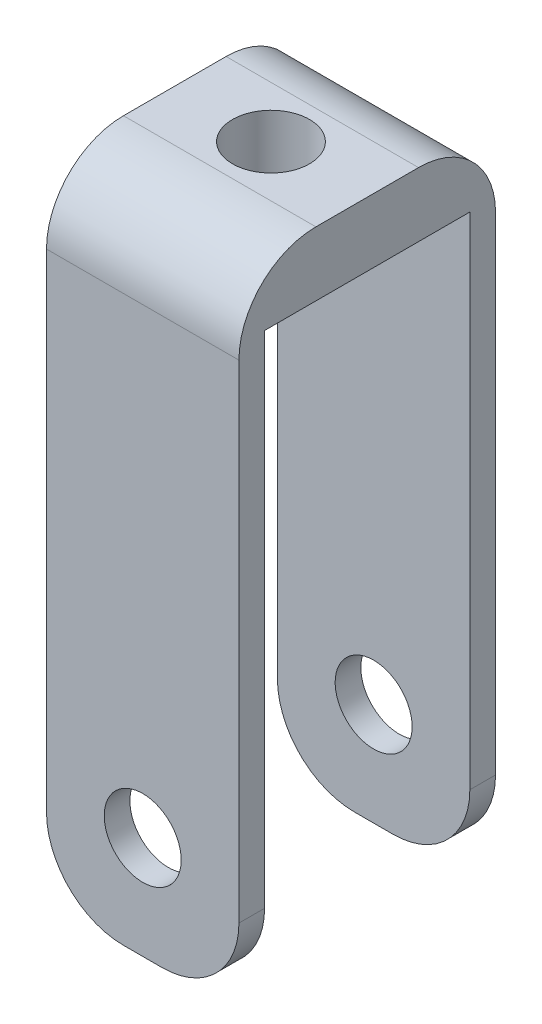
ISO-10303-21;
HEADER;
FILE_DESCRIPTION(('STEP AP214'),'2;1');
FILE_NAME('part.step','',(''),(''),'','','');
FILE_SCHEMA(('AUTOMOTIVE_DESIGN { 1 0 10303 214 1 1 1 1 }'));
ENDSEC;
DATA;
#1=APPLICATION_CONTEXT('core data for automotive mechanical design processes');
#2=APPLICATION_PROTOCOL_DEFINITION('international standard','automotive_design',2000,#1);
#3=PRODUCT_CONTEXT('',#1,'mechanical');
#4=PRODUCT('Part','Part','',(#3));
#5=PRODUCT_RELATED_PRODUCT_CATEGORY('part','',(#4));
#6=PRODUCT_DEFINITION_FORMATION('','',#4);
#7=PRODUCT_DEFINITION_CONTEXT('part definition',#1,'design');
#8=PRODUCT_DEFINITION('design','',#6,#7);
#9=PRODUCT_DEFINITION_SHAPE('','',#8);
#10=(LENGTH_UNIT() NAMED_UNIT(*) SI_UNIT(.MILLI.,.METRE.));
#11=(NAMED_UNIT(*) PLANE_ANGLE_UNIT() SI_UNIT($,.RADIAN.));
#12=(NAMED_UNIT(*) SI_UNIT($,.STERADIAN.) SOLID_ANGLE_UNIT());
#13=UNCERTAINTY_MEASURE_WITH_UNIT(LENGTH_MEASURE(1.E-05),#10,'distance_accuracy_value','');
#14=(GEOMETRIC_REPRESENTATION_CONTEXT(3) GLOBAL_UNCERTAINTY_ASSIGNED_CONTEXT((#13)) GLOBAL_UNIT_ASSIGNED_CONTEXT((#10,
#11,#12)) REPRESENTATION_CONTEXT('',''));
#15=CARTESIAN_POINT('',(0.,0.,0.));
#16=DIRECTION('',(0.,0.,1.));
#17=DIRECTION('',(1.,0.,0.));
#18=AXIS2_PLACEMENT_3D('',#15,#16,#17);
#19=CARTESIAN_POINT('',(7.5,0.,0.));
#20=DIRECTION('',(0.,-1.,0.));
#21=DIRECTION('',(0.,0.,-1.));
#22=AXIS2_PLACEMENT_3D('',#19,#20,#21);
#23=PLANE('',#22);
#24=CARTESIAN_POINT('',(0.,0.,0.));
#25=DIRECTION('',(0.,1.,0.));
#26=DIRECTION('',(0.,0.,1.));
#27=AXIS2_PLACEMENT_3D('',#24,#25,#26);
#28=CIRCLE('',#27,3.);
#29=CARTESIAN_POINT('',(0.,0.,3.));
#30=VERTEX_POINT('',#29);
#31=EDGE_CURVE('E200',#30,#30,#28,.T.);
#32=ORIENTED_EDGE('',*,*,#31,.F.);
#33=EDGE_LOOP('',(#32));
#34=FACE_BOUND('',#33,.T.);
#35=DIRECTION('',(0.,0.,1.));
#36=VECTOR('',#35,1.);
#37=CARTESIAN_POINT('',(7.5,0.,0.));
#38=LINE('',#37,#36);
#39=CARTESIAN_POINT('',(7.5,0.,-4.));
#40=VERTEX_POINT('',#39);
#41=CARTESIAN_POINT('',(7.5,0.,4.));
#42=VERTEX_POINT('',#41);
#43=EDGE_CURVE('E187',#40,#42,#38,.T.);
#44=ORIENTED_EDGE('',*,*,#43,.F.);
#45=DIRECTION('',(-1.,0.,0.));
#46=VECTOR('',#45,1.);
#47=CARTESIAN_POINT('',(7.5,0.,-4.));
#48=LINE('',#47,#46);
#49=CARTESIAN_POINT('',(-7.5,0.,-4.));
#50=VERTEX_POINT('',#49);
#51=EDGE_CURVE('E202',#40,#50,#48,.T.);
#52=ORIENTED_EDGE('',*,*,#51,.T.);
#53=DIRECTION('',(0.,0.,1.));
#54=VECTOR('',#53,1.);
#55=CARTESIAN_POINT('',(-7.5,0.,0.));
#56=LINE('',#55,#54);
#57=CARTESIAN_POINT('',(-7.5,0.,4.));
#58=VERTEX_POINT('',#57);
#59=EDGE_CURVE('E172',#50,#58,#56,.T.);
#60=ORIENTED_EDGE('',*,*,#59,.T.);
#61=DIRECTION('',(-1.,0.,0.));
#62=VECTOR('',#61,1.);
#63=CARTESIAN_POINT('',(7.5,0.,4.));
#64=LINE('',#63,#62);
#65=EDGE_CURVE('E197',#58,#42,#64,.F.);
#66=ORIENTED_EDGE('',*,*,#65,.T.);
#67=EDGE_LOOP('',(#44,#52,#60,#66));
#68=FACE_BOUND('',#67,.T.);
#69=ADVANCED_FACE('F35',(#34,#68),#23,.F.);
#70=CARTESIAN_POINT('',(7.5,0.,10.));
#71=DIRECTION('',(0.,0.,-1.));
#72=DIRECTION('',(0.,1.,0.));
#73=AXIS2_PLACEMENT_3D('',#70,#71,#72);
#74=PLANE('',#73);
#75=CARTESIAN_POINT('',(0.,-42.,10.));
#76=DIRECTION('',(0.,0.,1.));
#77=DIRECTION('',(1.,0.,0.));
#78=AXIS2_PLACEMENT_3D('',#75,#76,#77);
#79=CIRCLE('',#78,3.);
#80=CARTESIAN_POINT('',(3.,-42.,10.));
#81=VERTEX_POINT('',#80);
#82=EDGE_CURVE('E285',#81,#81,#79,.T.);
#83=ORIENTED_EDGE('',*,*,#82,.F.);
#84=EDGE_LOOP('',(#83));
#85=FACE_BOUND('',#84,.T.);
#86=DIRECTION('',(0.,-1.,0.));
#87=VECTOR('',#86,1.);
#88=CARTESIAN_POINT('',(7.5,0.,10.));
#89=LINE('',#88,#87);
#90=CARTESIAN_POINT('',(7.5,-6.,10.));
#91=VERTEX_POINT('',#90);
#92=CARTESIAN_POINT('',(7.5,-44.,9.99999999999999));
#93=VERTEX_POINT('',#92);
#94=EDGE_CURVE('E148',#91,#93,#89,.T.);
#95=ORIENTED_EDGE('',*,*,#94,.F.);
#96=DIRECTION('',(-1.,0.,0.));
#97=VECTOR('',#96,1.);
#98=CARTESIAN_POINT('',(7.5,-6.,10.));
#99=LINE('',#98,#97);
#100=CARTESIAN_POINT('',(-7.5,-6.,10.));
#101=VERTEX_POINT('',#100);
#102=EDGE_CURVE('E231',#91,#101,#99,.T.);
#103=ORIENTED_EDGE('',*,*,#102,.T.);
#104=DIRECTION('',(0.,-1.,0.));
#105=VECTOR('',#104,1.);
#106=CARTESIAN_POINT('',(-7.5,0.,10.));
#107=LINE('',#106,#105);
#108=CARTESIAN_POINT('',(-7.5,-44.,9.99999999999999));
#109=VERTEX_POINT('',#108);
#110=EDGE_CURVE('E175',#101,#109,#107,.T.);
#111=ORIENTED_EDGE('',*,*,#110,.T.);
#112=CARTESIAN_POINT('',(-1.5,-44.,9.99999999999999));
#113=DIRECTION('',(0.,0.,-1.));
#114=DIRECTION('',(0.,1.,0.));
#115=AXIS2_PLACEMENT_3D('',#112,#113,#114);
#116=CIRCLE('',#115,6.);
#117=CARTESIAN_POINT('',(-1.5,-50.,9.99999999999999));
#118=VERTEX_POINT('',#117);
#119=EDGE_CURVE('E229',#109,#118,#116,.F.);
#120=ORIENTED_EDGE('',*,*,#119,.T.);
#121=DIRECTION('',(-1.,0.,0.));
#122=VECTOR('',#121,1.);
#123=CARTESIAN_POINT('',(7.5,-50.,9.99999999999999));
#124=LINE('',#123,#122);
#125=CARTESIAN_POINT('',(1.5,-50.,9.99999999999999));
#126=VERTEX_POINT('',#125);
#127=EDGE_CURVE('E194',#126,#118,#124,.T.);
#128=ORIENTED_EDGE('',*,*,#127,.F.);
#129=CARTESIAN_POINT('',(1.5,-44.,9.99999999999999));
#130=DIRECTION('',(0.,0.,-1.));
#131=DIRECTION('',(0.,1.,0.));
#132=AXIS2_PLACEMENT_3D('',#129,#130,#131);
#133=CIRCLE('',#132,6.);
#134=EDGE_CURVE('E227',#126,#93,#133,.F.);
#135=ORIENTED_EDGE('',*,*,#134,.T.);
#136=EDGE_LOOP('',(#95,#103,#111,#120,#128,#135));
#137=FACE_BOUND('',#136,.T.);
#138=ADVANCED_FACE('F310',(#85,#137),#74,.F.);
#139=CARTESIAN_POINT('',(7.5,-50.,9.99999999999999));
#140=DIRECTION('',(0.,1.,0.));
#141=DIRECTION('',(0.,0.,1.));
#142=AXIS2_PLACEMENT_3D('',#139,#140,#141);
#143=PLANE('',#142);
#144=ORIENTED_EDGE('',*,*,#127,.T.);
#145=DIRECTION('',(0.,0.,-1.));
#146=VECTOR('',#145,1.);
#147=CARTESIAN_POINT('',(-1.5,-50.,9.99999999999999));
#148=LINE('',#147,#146);
#149=CARTESIAN_POINT('',(-1.5,-50.,7.99999999999999));
#150=VERTEX_POINT('',#149);
#151=EDGE_CURVE('E236',#118,#150,#148,.T.);
#152=ORIENTED_EDGE('',*,*,#151,.T.);
#153=DIRECTION('',(-1.,0.,0.));
#154=VECTOR('',#153,1.);
#155=CARTESIAN_POINT('',(7.5,-50.,7.99999999999999));
#156=LINE('',#155,#154);
#157=CARTESIAN_POINT('',(1.5,-50.,7.99999999999999));
#158=VERTEX_POINT('',#157);
#159=EDGE_CURVE('E158',#158,#150,#156,.T.);
#160=ORIENTED_EDGE('',*,*,#159,.F.);
#161=DIRECTION('',(0.,0.,-1.));
#162=VECTOR('',#161,1.);
#163=CARTESIAN_POINT('',(1.5,-50.,9.99999999999999));
#164=LINE('',#163,#162);
#165=EDGE_CURVE('E234',#158,#126,#164,.F.);
#166=ORIENTED_EDGE('',*,*,#165,.T.);
#167=EDGE_LOOP('',(#144,#152,#160,#166));
#168=FACE_BOUND('',#167,.T.);
#169=ADVANCED_FACE('F316',(#168),#143,.F.);
#170=CARTESIAN_POINT('',(7.5,-50.,7.99999999999999));
#171=DIRECTION('',(0.,0.,1.));
#172=DIRECTION('',(1.,0.,0.));
#173=AXIS2_PLACEMENT_3D('',#170,#171,#172);
#174=PLANE('',#173);
#175=CARTESIAN_POINT('',(0.,-42.,7.99999999999999));
#176=DIRECTION('',(0.,0.,1.));
#177=DIRECTION('',(1.,0.,0.));
#178=AXIS2_PLACEMENT_3D('',#175,#176,#177);
#179=CIRCLE('',#178,3.);
#180=CARTESIAN_POINT('',(3.,-42.,7.99999999999999));
#181=VERTEX_POINT('',#180);
#182=EDGE_CURVE('E278',#181,#181,#179,.T.);
#183=ORIENTED_EDGE('',*,*,#182,.T.);
#184=EDGE_LOOP('',(#183));
#185=FACE_BOUND('',#184,.T.);
#186=ORIENTED_EDGE('',*,*,#159,.T.);
#187=CARTESIAN_POINT('',(-1.5,-44.,7.99999999999999));
#188=DIRECTION('',(0.,0.,1.));
#189=DIRECTION('',(1.,0.,0.));
#190=AXIS2_PLACEMENT_3D('',#187,#188,#189);
#191=CIRCLE('',#190,6.);
#192=CARTESIAN_POINT('',(-7.5,-44.,7.99999999999999));
#193=VERTEX_POINT('',#192);
#194=EDGE_CURVE('E241',#150,#193,#191,.F.);
#195=ORIENTED_EDGE('',*,*,#194,.T.);
#196=DIRECTION('',(0.,1.,0.));
#197=VECTOR('',#196,1.);
#198=CARTESIAN_POINT('',(-7.5,-50.,7.99999999999999));
#199=LINE('',#198,#197);
#200=CARTESIAN_POINT('',(-7.5,-5.,7.99999999999999));
#201=VERTEX_POINT('',#200);
#202=EDGE_CURVE('E155',#193,#201,#199,.T.);
#203=ORIENTED_EDGE('',*,*,#202,.T.);
#204=DIRECTION('',(-1.,0.,0.));
#205=VECTOR('',#204,1.);
#206=CARTESIAN_POINT('',(7.5,-5.,7.99999999999999));
#207=LINE('',#206,#205);
#208=CARTESIAN_POINT('',(7.5,-5.,7.99999999999999));
#209=VERTEX_POINT('',#208);
#210=EDGE_CURVE('E151',#209,#201,#207,.T.);
#211=ORIENTED_EDGE('',*,*,#210,.F.);
#212=DIRECTION('',(0.,1.,0.));
#213=VECTOR('',#212,1.);
#214=CARTESIAN_POINT('',(7.5,-50.,7.99999999999999));
#215=LINE('',#214,#213);
#216=CARTESIAN_POINT('',(7.5,-44.,7.99999999999999));
#217=VERTEX_POINT('',#216);
#218=EDGE_CURVE('E136',#217,#209,#215,.T.);
#219=ORIENTED_EDGE('',*,*,#218,.F.);
#220=CARTESIAN_POINT('',(1.5,-44.,7.99999999999999));
#221=DIRECTION('',(0.,0.,1.));
#222=DIRECTION('',(1.,0.,0.));
#223=AXIS2_PLACEMENT_3D('',#220,#221,#222);
#224=CIRCLE('',#223,6.);
#225=EDGE_CURVE('E239',#217,#158,#224,.F.);
#226=ORIENTED_EDGE('',*,*,#225,.T.);
#227=EDGE_LOOP('',(#186,#195,#203,#211,#219,#226));
#228=FACE_BOUND('',#227,.T.);
#229=ADVANCED_FACE('F153',(#185,#228),#174,.F.);
#230=CARTESIAN_POINT('',(7.5,-5.,7.99999999999999));
#231=DIRECTION('',(0.,1.,0.));
#232=DIRECTION('',(0.,0.,1.));
#233=AXIS2_PLACEMENT_3D('',#230,#231,#232);
#234=PLANE('',#233);
#235=CARTESIAN_POINT('',(0.,-5.,0.));
#236=DIRECTION('',(0.,1.,0.));
#237=DIRECTION('',(0.,0.,1.));
#238=AXIS2_PLACEMENT_3D('',#235,#236,#237);
#239=CIRCLE('',#238,3.);
#240=CARTESIAN_POINT('',(0.,-5.,3.));
#241=VERTEX_POINT('',#240);
#242=EDGE_CURVE('E176',#241,#241,#239,.T.);
#243=ORIENTED_EDGE('',*,*,#242,.T.);
#244=EDGE_LOOP('',(#243));
#245=FACE_BOUND('',#244,.T.);
#246=DIRECTION('',(0.,0.,-1.));
#247=VECTOR('',#246,1.);
#248=CARTESIAN_POINT('',(-7.5,-5.,7.99999999999999));
#249=LINE('',#248,#247);
#250=CARTESIAN_POINT('',(-7.5,-5.,-7.99999999999999));
#251=VERTEX_POINT('',#250);
#252=EDGE_CURVE('E180',#201,#251,#249,.T.);
#253=ORIENTED_EDGE('',*,*,#252,.T.);
#254=DIRECTION('',(-1.,0.,0.));
#255=VECTOR('',#254,1.);
#256=CARTESIAN_POINT('',(7.5,-5.,-7.99999999999999));
#257=LINE('',#256,#255);
#258=CARTESIAN_POINT('',(7.5,-5.,-7.99999999999999));
#259=VERTEX_POINT('',#258);
#260=EDGE_CURVE('E159',#259,#251,#257,.T.);
#261=ORIENTED_EDGE('',*,*,#260,.F.);
#262=DIRECTION('',(0.,0.,-1.));
#263=VECTOR('',#262,1.);
#264=CARTESIAN_POINT('',(7.5,-5.,7.99999999999999));
#265=LINE('',#264,#263);
#266=EDGE_CURVE('E142',#209,#259,#265,.T.);
#267=ORIENTED_EDGE('',*,*,#266,.F.);
#268=ORIENTED_EDGE('',*,*,#210,.T.);
#269=EDGE_LOOP('',(#253,#261,#267,#268));
#270=FACE_BOUND('',#269,.T.);
#271=ADVANCED_FACE('F161',(#245,#270),#234,.F.);
#272=CARTESIAN_POINT('',(7.5,-5.,-7.99999999999999));
#273=DIRECTION('',(0.,0.,-1.));
#274=DIRECTION('',(0.,1.,0.));
#275=AXIS2_PLACEMENT_3D('',#272,#273,#274);
#276=PLANE('',#275);
#277=CARTESIAN_POINT('',(0.,-42.,-8.));
#278=DIRECTION('',(0.,0.,-1.));
#279=DIRECTION('',(0.,1.,0.));
#280=AXIS2_PLACEMENT_3D('',#277,#278,#279);
#281=CIRCLE('',#280,3.);
#282=CARTESIAN_POINT('',(0.,-39.,-8.));
#283=VERTEX_POINT('',#282);
#284=EDGE_CURVE('E281',#283,#283,#281,.T.);
#285=ORIENTED_EDGE('',*,*,#284,.T.);
#286=EDGE_LOOP('',(#285));
#287=FACE_BOUND('',#286,.T.);
#288=DIRECTION('',(0.,-1.,0.));
#289=VECTOR('',#288,1.);
#290=CARTESIAN_POINT('',(-7.5,-5.,-7.99999999999999));
#291=LINE('',#290,#289);
#292=CARTESIAN_POINT('',(-7.5,-44.,-8.));
#293=VERTEX_POINT('',#292);
#294=EDGE_CURVE('E182',#251,#293,#291,.T.);
#295=ORIENTED_EDGE('',*,*,#294,.T.);
#296=CARTESIAN_POINT('',(-1.5,-44.,-8.));
#297=DIRECTION('',(0.,0.,-1.));
#298=DIRECTION('',(0.,1.,0.));
#299=AXIS2_PLACEMENT_3D('',#296,#297,#298);
#300=CIRCLE('',#299,6.);
#301=CARTESIAN_POINT('',(-1.5,-50.,-8.));
#302=VERTEX_POINT('',#301);
#303=EDGE_CURVE('E11',#293,#302,#300,.F.);
#304=ORIENTED_EDGE('',*,*,#303,.T.);
#305=DIRECTION('',(-1.,0.,0.));
#306=VECTOR('',#305,1.);
#307=CARTESIAN_POINT('',(7.5,-50.,-8.));
#308=LINE('',#307,#306);
#309=CARTESIAN_POINT('',(1.5,-50.,-8.));
#310=VERTEX_POINT('',#309);
#311=EDGE_CURVE('E190',#310,#302,#308,.T.);
#312=ORIENTED_EDGE('',*,*,#311,.F.);
#313=CARTESIAN_POINT('',(1.5,-44.,-8.));
#314=DIRECTION('',(0.,0.,-1.));
#315=DIRECTION('',(0.,1.,0.));
#316=AXIS2_PLACEMENT_3D('',#313,#314,#315);
#317=CIRCLE('',#316,6.);
#318=CARTESIAN_POINT('',(7.5,-44.,-8.));
#319=VERTEX_POINT('',#318);
#320=EDGE_CURVE('E43',#310,#319,#317,.F.);
#321=ORIENTED_EDGE('',*,*,#320,.T.);
#322=DIRECTION('',(0.,-1.,0.));
#323=VECTOR('',#322,1.);
#324=CARTESIAN_POINT('',(7.5,-5.,-7.99999999999999));
#325=LINE('',#324,#323);
#326=EDGE_CURVE('E164',#259,#319,#325,.T.);
#327=ORIENTED_EDGE('',*,*,#326,.F.);
#328=ORIENTED_EDGE('',*,*,#260,.T.);
#329=EDGE_LOOP('',(#295,#304,#312,#321,#327,#328));
#330=FACE_BOUND('',#329,.T.);
#331=ADVANCED_FACE('F247',(#287,#330),#276,.F.);
#332=CARTESIAN_POINT('',(7.5,-50.,-8.));
#333=DIRECTION('',(0.,1.,0.));
#334=DIRECTION('',(0.,0.,1.));
#335=AXIS2_PLACEMENT_3D('',#332,#333,#334);
#336=PLANE('',#335);
#337=ORIENTED_EDGE('',*,*,#311,.T.);
#338=DIRECTION('',(0.,0.,-1.));
#339=VECTOR('',#338,1.);
#340=CARTESIAN_POINT('',(-1.5,-50.,-8.));
#341=LINE('',#340,#339);
#342=CARTESIAN_POINT('',(-1.5,-50.,-10.));
#343=VERTEX_POINT('',#342);
#344=EDGE_CURVE('E244',#302,#343,#341,.T.);
#345=ORIENTED_EDGE('',*,*,#344,.T.);
#346=DIRECTION('',(-1.,0.,0.));
#347=VECTOR('',#346,1.);
#348=CARTESIAN_POINT('',(7.5,-50.,-10.));
#349=LINE('',#348,#347);
#350=CARTESIAN_POINT('',(1.5,-50.,-10.));
#351=VERTEX_POINT('',#350);
#352=EDGE_CURVE('E171',#351,#343,#349,.T.);
#353=ORIENTED_EDGE('',*,*,#352,.F.);
#354=DIRECTION('',(0.,0.,-1.));
#355=VECTOR('',#354,1.);
#356=CARTESIAN_POINT('',(1.5,-50.,-8.));
#357=LINE('',#356,#355);
#358=EDGE_CURVE('E55',#351,#310,#357,.F.);
#359=ORIENTED_EDGE('',*,*,#358,.T.);
#360=EDGE_LOOP('',(#337,#345,#353,#359));
#361=FACE_BOUND('',#360,.T.);
#362=ADVANCED_FACE('F254',(#361),#336,.F.);
#363=CARTESIAN_POINT('',(7.5,-50.,-10.));
#364=DIRECTION('',(0.,0.,1.));
#365=DIRECTION('',(1.,0.,0.));
#366=AXIS2_PLACEMENT_3D('',#363,#364,#365);
#367=PLANE('',#366);
#368=CARTESIAN_POINT('',(0.,-42.,-10.));
#369=DIRECTION('',(0.,0.,1.));
#370=DIRECTION('',(1.,0.,0.));
#371=AXIS2_PLACEMENT_3D('',#368,#369,#370);
#372=CIRCLE('',#371,3.);
#373=CARTESIAN_POINT('',(3.,-42.,-10.));
#374=VERTEX_POINT('',#373);
#375=EDGE_CURVE('E284',#374,#374,#372,.T.);
#376=ORIENTED_EDGE('',*,*,#375,.T.);
#377=EDGE_LOOP('',(#376));
#378=FACE_BOUND('',#377,.T.);
#379=DIRECTION('',(0.,1.,0.));
#380=VECTOR('',#379,1.);
#381=CARTESIAN_POINT('',(-7.5,-50.,-10.));
#382=LINE('',#381,#380);
#383=CARTESIAN_POINT('',(-7.5,-44.,-10.));
#384=VERTEX_POINT('',#383);
#385=CARTESIAN_POINT('',(-7.5,-6.,-10.));
#386=VERTEX_POINT('',#385);
#387=EDGE_CURVE('E184',#384,#386,#382,.T.);
#388=ORIENTED_EDGE('',*,*,#387,.T.);
#389=DIRECTION('',(-1.,0.,0.));
#390=VECTOR('',#389,1.);
#391=CARTESIAN_POINT('',(7.5,-6.,-10.));
#392=LINE('',#391,#390);
#393=CARTESIAN_POINT('',(7.5,-6.,-10.));
#394=VERTEX_POINT('',#393);
#395=EDGE_CURVE('E217',#386,#394,#392,.F.);
#396=ORIENTED_EDGE('',*,*,#395,.T.);
#397=DIRECTION('',(0.,1.,0.));
#398=VECTOR('',#397,1.);
#399=CARTESIAN_POINT('',(7.5,-50.,-10.));
#400=LINE('',#399,#398);
#401=CARTESIAN_POINT('',(7.5,-44.,-10.));
#402=VERTEX_POINT('',#401);
#403=EDGE_CURVE('E166',#402,#394,#400,.T.);
#404=ORIENTED_EDGE('',*,*,#403,.F.);
#405=CARTESIAN_POINT('',(1.5,-44.,-10.));
#406=DIRECTION('',(0.,0.,1.));
#407=DIRECTION('',(1.,0.,0.));
#408=AXIS2_PLACEMENT_3D('',#405,#406,#407);
#409=CIRCLE('',#408,6.);
#410=EDGE_CURVE('E213',#402,#351,#409,.F.);
#411=ORIENTED_EDGE('',*,*,#410,.T.);
#412=ORIENTED_EDGE('',*,*,#352,.T.);
#413=CARTESIAN_POINT('',(-1.5,-44.,-10.));
#414=DIRECTION('',(0.,0.,1.));
#415=DIRECTION('',(1.,0.,0.));
#416=AXIS2_PLACEMENT_3D('',#413,#414,#415);
#417=CIRCLE('',#416,6.);
#418=EDGE_CURVE('E215',#343,#384,#417,.F.);
#419=ORIENTED_EDGE('',*,*,#418,.T.);
#420=EDGE_LOOP('',(#388,#396,#404,#411,#412,#419));
#421=FACE_BOUND('',#420,.T.);
#422=ADVANCED_FACE('F253',(#378,#421),#367,.F.);
#423=CARTESIAN_POINT('',(7.5,0.,0.));
#424=DIRECTION('',(1.,0.,0.));
#425=DIRECTION('',(0.,0.,-1.));
#426=AXIS2_PLACEMENT_3D('',#423,#424,#425);
#427=PLANE('',#426);
#428=ORIENTED_EDGE('',*,*,#403,.T.);
#429=CARTESIAN_POINT('',(7.5,-6.,-4.));
#430=DIRECTION('',(1.,0.,0.));
#431=DIRECTION('',(0.,0.,-1.));
#432=AXIS2_PLACEMENT_3D('',#429,#430,#431);
#433=CIRCLE('',#432,6.);
#434=EDGE_CURVE('E225',#394,#40,#433,.T.);
#435=ORIENTED_EDGE('',*,*,#434,.T.);
#436=ORIENTED_EDGE('',*,*,#43,.T.);
#437=CARTESIAN_POINT('',(7.5,-6.,4.));
#438=DIRECTION('',(1.,0.,0.));
#439=DIRECTION('',(0.,0.,-1.));
#440=AXIS2_PLACEMENT_3D('',#437,#438,#439);
#441=CIRCLE('',#440,6.);
#442=EDGE_CURVE('E223',#42,#91,#441,.T.);
#443=ORIENTED_EDGE('',*,*,#442,.T.);
#444=ORIENTED_EDGE('',*,*,#94,.T.);
#445=DIRECTION('',(0.,0.,-1.));
#446=VECTOR('',#445,1.);
#447=CARTESIAN_POINT('',(7.5,-44.,7.99999999999997));
#448=LINE('',#447,#446);
#449=EDGE_CURVE('E146',#93,#217,#448,.T.);
#450=ORIENTED_EDGE('',*,*,#449,.T.);
#451=ORIENTED_EDGE('',*,*,#218,.T.);
#452=ORIENTED_EDGE('',*,*,#266,.T.);
#453=ORIENTED_EDGE('',*,*,#326,.T.);
#454=DIRECTION('',(0.,0.,-1.));
#455=VECTOR('',#454,1.);
#456=CARTESIAN_POINT('',(7.5,-44.,-10.));
#457=LINE('',#456,#455);
#458=EDGE_CURVE('E220',#319,#402,#457,.T.);
#459=ORIENTED_EDGE('',*,*,#458,.T.);
#460=EDGE_LOOP('',(#428,#435,#436,#443,#444,#450,#451,#452,#453,#459));
#461=FACE_BOUND('',#460,.T.);
#462=ADVANCED_FACE('F139',(#461),#427,.T.);
#463=CARTESIAN_POINT('',(-7.5,0.,0.));
#464=DIRECTION('',(1.,0.,0.));
#465=DIRECTION('',(0.,0.,-1.));
#466=AXIS2_PLACEMENT_3D('',#463,#464,#465);
#467=PLANE('',#466);
#468=ORIENTED_EDGE('',*,*,#59,.F.);
#469=CARTESIAN_POINT('',(-7.5,-6.,-4.));
#470=DIRECTION('',(1.,0.,0.));
#471=DIRECTION('',(0.,0.,-1.));
#472=AXIS2_PLACEMENT_3D('',#469,#470,#471);
#473=CIRCLE('',#472,6.);
#474=EDGE_CURVE('E211',#50,#386,#473,.F.);
#475=ORIENTED_EDGE('',*,*,#474,.T.);
#476=ORIENTED_EDGE('',*,*,#387,.F.);
#477=DIRECTION('',(0.,0.,-1.));
#478=VECTOR('',#477,1.);
#479=CARTESIAN_POINT('',(-7.5,-44.,0.));
#480=LINE('',#479,#478);
#481=EDGE_CURVE('E205',#384,#293,#480,.F.);
#482=ORIENTED_EDGE('',*,*,#481,.T.);
#483=ORIENTED_EDGE('',*,*,#294,.F.);
#484=ORIENTED_EDGE('',*,*,#252,.F.);
#485=ORIENTED_EDGE('',*,*,#202,.F.);
#486=DIRECTION('',(0.,0.,-1.));
#487=VECTOR('',#486,1.);
#488=CARTESIAN_POINT('',(-7.5,-44.,1.52655665885959E-13));
#489=LINE('',#488,#487);
#490=EDGE_CURVE('E207',#193,#109,#489,.F.);
#491=ORIENTED_EDGE('',*,*,#490,.T.);
#492=ORIENTED_EDGE('',*,*,#110,.F.);
#493=CARTESIAN_POINT('',(-7.5,-6.,4.));
#494=DIRECTION('',(1.,0.,0.));
#495=DIRECTION('',(0.,0.,-1.));
#496=AXIS2_PLACEMENT_3D('',#493,#494,#495);
#497=CIRCLE('',#496,6.);
#498=EDGE_CURVE('E209',#101,#58,#497,.F.);
#499=ORIENTED_EDGE('',*,*,#498,.T.);
#500=EDGE_LOOP('',(#468,#475,#476,#482,#483,#484,#485,#491,#492,#499));
#501=FACE_BOUND('',#500,.T.);
#502=ADVANCED_FACE('F263',(#501),#467,.F.);
#503=CARTESIAN_POINT('',(0.,-15.,0.));
#504=DIRECTION('',(0.,1.,0.));
#505=DIRECTION('',(0.,0.,1.));
#506=AXIS2_PLACEMENT_3D('',#503,#504,#505);
#507=CYLINDRICAL_SURFACE('',#506,3.);
#508=ORIENTED_EDGE('',*,*,#31,.T.);
#509=EDGE_LOOP('',(#508));
#510=FACE_BOUND('',#509,.T.);
#511=ORIENTED_EDGE('',*,*,#242,.F.);
#512=EDGE_LOOP('',(#511));
#513=FACE_BOUND('',#512,.T.);
#514=ADVANCED_FACE('F296',(#510,#513),#507,.F.);
#515=CARTESIAN_POINT('',(0.,-42.,-10.));
#516=DIRECTION('',(0.,0.,1.));
#517=DIRECTION('',(1.,0.,0.));
#518=AXIS2_PLACEMENT_3D('',#515,#516,#517);
#519=CYLINDRICAL_SURFACE('',#518,3.);
#520=ORIENTED_EDGE('',*,*,#375,.F.);
#521=EDGE_LOOP('',(#520));
#522=FACE_BOUND('',#521,.T.);
#523=ORIENTED_EDGE('',*,*,#284,.F.);
#524=EDGE_LOOP('',(#523));
#525=FACE_BOUND('',#524,.T.);
#526=ADVANCED_FACE('F292',(#522,#525),#519,.F.);
#527=ORIENTED_EDGE('',*,*,#82,.T.);
#528=EDGE_LOOP('',(#527));
#529=FACE_BOUND('',#528,.T.);
#530=ORIENTED_EDGE('',*,*,#182,.F.);
#531=EDGE_LOOP('',(#530));
#532=FACE_BOUND('',#531,.T.);
#533=ADVANCED_FACE('F295',(#529,#532),#519,.F.);
#534=CARTESIAN_POINT('',(7.5,-6.,-4.));
#535=DIRECTION('',(-1.,0.,0.));
#536=DIRECTION('',(0.,0.,1.));
#537=AXIS2_PLACEMENT_3D('',#534,#535,#536);
#538=CYLINDRICAL_SURFACE('',#537,6.);
#539=ORIENTED_EDGE('',*,*,#434,.F.);
#540=ORIENTED_EDGE('',*,*,#395,.F.);
#541=ORIENTED_EDGE('',*,*,#474,.F.);
#542=ORIENTED_EDGE('',*,*,#51,.F.);
#543=EDGE_LOOP('',(#539,#540,#541,#542));
#544=FACE_BOUND('',#543,.T.);
#545=ADVANCED_FACE('F268',(#544),#538,.T.);
#546=CARTESIAN_POINT('',(7.5,-6.,4.));
#547=DIRECTION('',(-1.,0.,0.));
#548=DIRECTION('',(0.,0.,1.));
#549=AXIS2_PLACEMENT_3D('',#546,#547,#548);
#550=CYLINDRICAL_SURFACE('',#549,6.);
#551=ORIENTED_EDGE('',*,*,#442,.F.);
#552=ORIENTED_EDGE('',*,*,#65,.F.);
#553=ORIENTED_EDGE('',*,*,#498,.F.);
#554=ORIENTED_EDGE('',*,*,#102,.F.);
#555=EDGE_LOOP('',(#551,#552,#553,#554));
#556=FACE_BOUND('',#555,.T.);
#557=ADVANCED_FACE('F324',(#556),#550,.T.);
#558=CARTESIAN_POINT('',(-1.5,-44.,9.99999999999997));
#559=DIRECTION('',(0.,0.,-1.));
#560=DIRECTION('',(0.,1.,0.));
#561=AXIS2_PLACEMENT_3D('',#558,#559,#560);
#562=CYLINDRICAL_SURFACE('',#561,6.);
#563=ORIENTED_EDGE('',*,*,#119,.F.);
#564=ORIENTED_EDGE('',*,*,#490,.F.);
#565=ORIENTED_EDGE('',*,*,#194,.F.);
#566=ORIENTED_EDGE('',*,*,#151,.F.);
#567=EDGE_LOOP('',(#563,#564,#565,#566));
#568=FACE_BOUND('',#567,.T.);
#569=ADVANCED_FACE('F327',(#568),#562,.T.);
#570=CARTESIAN_POINT('',(-1.5,-44.,-8.));
#571=DIRECTION('',(0.,0.,-1.));
#572=DIRECTION('',(-1.,0.,0.));
#573=AXIS2_PLACEMENT_3D('',#570,#571,#572);
#574=CYLINDRICAL_SURFACE('',#573,6.);
#575=ORIENTED_EDGE('',*,*,#303,.F.);
#576=ORIENTED_EDGE('',*,*,#481,.F.);
#577=ORIENTED_EDGE('',*,*,#418,.F.);
#578=ORIENTED_EDGE('',*,*,#344,.F.);
#579=EDGE_LOOP('',(#575,#576,#577,#578));
#580=FACE_BOUND('',#579,.T.);
#581=ADVANCED_FACE('F257',(#580),#574,.T.);
#582=CARTESIAN_POINT('',(1.5,-44.,0.));
#583=DIRECTION('',(0.,0.,1.));
#584=DIRECTION('',(1.,0.,0.));
#585=AXIS2_PLACEMENT_3D('',#582,#583,#584);
#586=CYLINDRICAL_SURFACE('',#585,6.);
#587=ORIENTED_EDGE('',*,*,#320,.F.);
#588=ORIENTED_EDGE('',*,*,#358,.F.);
#589=ORIENTED_EDGE('',*,*,#410,.F.);
#590=ORIENTED_EDGE('',*,*,#458,.F.);
#591=EDGE_LOOP('',(#587,#588,#589,#590));
#592=FACE_BOUND('',#591,.T.);
#593=ADVANCED_FACE('F251',(#592),#586,.T.);
#594=CARTESIAN_POINT('',(1.5,-44.,1.52655665885959E-13));
#595=DIRECTION('',(0.,0.,1.));
#596=DIRECTION('',(0.,-1.,0.));
#597=AXIS2_PLACEMENT_3D('',#594,#595,#596);
#598=CYLINDRICAL_SURFACE('',#597,6.);
#599=ORIENTED_EDGE('',*,*,#134,.F.);
#600=ORIENTED_EDGE('',*,*,#165,.F.);
#601=ORIENTED_EDGE('',*,*,#225,.F.);
#602=ORIENTED_EDGE('',*,*,#449,.F.);
#603=EDGE_LOOP('',(#599,#600,#601,#602));
#604=FACE_BOUND('',#603,.T.);
#605=ADVANCED_FACE('F37',(#604),#598,.T.);
#606=CLOSED_SHELL('',(#69,#138,#169,#229,#271,#331,#362,#422,#462,#502,#514,#526,#533,#545,#557,
#569,#581,#593,#605));
#607=MANIFOLD_SOLID_BREP('B2',#606);
#608=ADVANCED_BREP_SHAPE_REPRESENTATION('',(#18,#607),#14);
#609=SHAPE_DEFINITION_REPRESENTATION(#9,#608);
ENDSEC;
END-ISO-10303-21;
